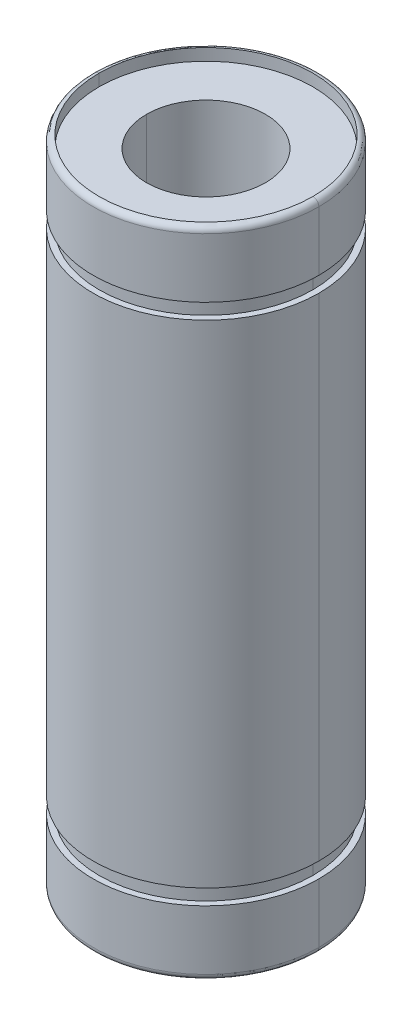
ISO-10303-21;
HEADER;
FILE_DESCRIPTION(('STEP AP214'),'2;1');
FILE_NAME('part.step','',(''),(''),'','','');
FILE_SCHEMA(('AUTOMOTIVE_DESIGN { 1 0 10303 214 1 1 1 1 }'));
ENDSEC;
DATA;
#1=APPLICATION_CONTEXT('core data for automotive mechanical design processes');
#2=APPLICATION_PROTOCOL_DEFINITION('international standard','automotive_design',2000,#1);
#3=PRODUCT_CONTEXT('',#1,'mechanical');
#4=PRODUCT('Part','Part','',(#3));
#5=PRODUCT_RELATED_PRODUCT_CATEGORY('part','',(#4));
#6=PRODUCT_DEFINITION_FORMATION('','',#4);
#7=PRODUCT_DEFINITION_CONTEXT('part definition',#1,'design');
#8=PRODUCT_DEFINITION('design','',#6,#7);
#9=PRODUCT_DEFINITION_SHAPE('','',#8);
#10=(LENGTH_UNIT() NAMED_UNIT(*) SI_UNIT(.MILLI.,.METRE.));
#11=(NAMED_UNIT(*) PLANE_ANGLE_UNIT() SI_UNIT($,.RADIAN.));
#12=(NAMED_UNIT(*) SI_UNIT($,.STERADIAN.) SOLID_ANGLE_UNIT());
#13=UNCERTAINTY_MEASURE_WITH_UNIT(LENGTH_MEASURE(1.E-05),#10,'distance_accuracy_value','');
#14=(GEOMETRIC_REPRESENTATION_CONTEXT(3) GLOBAL_UNCERTAINTY_ASSIGNED_CONTEXT((#13)) GLOBAL_UNIT_ASSIGNED_CONTEXT((#10,
#11,#12)) REPRESENTATION_CONTEXT('',''));
#15=CARTESIAN_POINT('',(0.,0.,0.));
#16=DIRECTION('',(0.,0.,1.));
#17=DIRECTION('',(1.,0.,0.));
#18=AXIS2_PLACEMENT_3D('',#15,#16,#17);
#19=CARTESIAN_POINT('',(138.847826098004,137.740489125517,27.5));
#20=DIRECTION('',(0.,-1.,0.));
#21=DIRECTION('',(-1.,0.,0.));
#22=AXIS2_PLACEMENT_3D('',#19,#20,#21);
#23=PLANE('',#22);
#24=CARTESIAN_POINT('',(138.847826098004,137.740489125517,27.5));
#25=DIRECTION('',(0.,1.,0.));
#26=DIRECTION('',(1.,0.,0.));
#27=AXIS2_PLACEMENT_3D('',#24,#25,#26);
#28=CIRCLE('',#27,9.);
#29=CARTESIAN_POINT('',(147.847826098004,137.740489125517,27.5));
#30=VERTEX_POINT('',#29);
#31=CARTESIAN_POINT('',(129.847826098004,137.740489125517,27.5));
#32=VERTEX_POINT('',#31);
#33=EDGE_CURVE('P0_E11',#30,#32,#28,.T.);
#34=ORIENTED_EDGE('',*,*,#33,.T.);
#35=CARTESIAN_POINT('',(138.847826098004,137.740489125517,27.5));
#36=DIRECTION('',(0.,1.,0.));
#37=DIRECTION('',(1.,0.,0.));
#38=AXIS2_PLACEMENT_3D('',#35,#36,#37);
#39=CIRCLE('',#38,9.);
#40=EDGE_CURVE('P0_E99',#32,#30,#39,.T.);
#41=ORIENTED_EDGE('',*,*,#40,.T.);
#42=EDGE_LOOP('',(#34,#41));
#43=FACE_BOUND('',#42,.T.);
#44=CARTESIAN_POINT('',(138.847826098004,137.740489125517,27.5));
#45=DIRECTION('',(0.,1.,0.));
#46=DIRECTION('',(1.,0.,0.));
#47=AXIS2_PLACEMENT_3D('',#44,#45,#46);
#48=CIRCLE('',#47,9.5);
#49=CARTESIAN_POINT('',(148.347826098004,137.740489125517,27.5));
#50=VERTEX_POINT('',#49);
#51=CARTESIAN_POINT('',(129.347826098004,137.740489125517,27.5));
#52=VERTEX_POINT('',#51);
#53=EDGE_CURVE('P0_E27',#50,#52,#48,.T.);
#54=ORIENTED_EDGE('',*,*,#53,.F.);
#55=CARTESIAN_POINT('',(138.847826098004,137.740489125517,27.5));
#56=DIRECTION('',(0.,1.,0.));
#57=DIRECTION('',(1.,0.,0.));
#58=AXIS2_PLACEMENT_3D('',#55,#56,#57);
#59=CIRCLE('',#58,9.5);
#60=EDGE_CURVE('P0_E86',#52,#50,#59,.T.);
#61=ORIENTED_EDGE('',*,*,#60,.F.);
#62=EDGE_LOOP('',(#54,#61));
#63=FACE_BOUND('',#62,.T.);
#64=ADVANCED_FACE('P0_F16',(#43,#63),#23,.T.);
#65=CARTESIAN_POINT('',(138.847826098004,143.240489125517,27.5));
#66=DIRECTION('',(0.,-1.,0.));
#67=DIRECTION('',(1.,0.,0.));
#68=AXIS2_PLACEMENT_3D('',#65,#66,#67);
#69=CYLINDRICAL_SURFACE('',#68,9.);
#70=DIRECTION('',(0.,1.,0.));
#71=VECTOR('',#70,1.);
#72=CARTESIAN_POINT('',(147.847826098004,143.240489125517,27.5));
#73=LINE('',#72,#71);
#74=CARTESIAN_POINT('',(147.847826098004,143.240489125517,27.5));
#75=VERTEX_POINT('',#74);
#76=EDGE_CURVE('P0_E92',#30,#75,#73,.T.);
#77=ORIENTED_EDGE('',*,*,#76,.T.);
#78=CARTESIAN_POINT('',(138.847826098004,143.240489125517,27.5));
#79=DIRECTION('',(0.,-1.,0.));
#80=DIRECTION('',(1.,0.,0.));
#81=AXIS2_PLACEMENT_3D('',#78,#79,#80);
#82=CIRCLE('',#81,9.);
#83=CARTESIAN_POINT('',(129.847826098004,143.240489125517,27.5));
#84=VERTEX_POINT('',#83);
#85=EDGE_CURVE('P0_E64',#84,#75,#82,.T.);
#86=ORIENTED_EDGE('',*,*,#85,.F.);
#87=DIRECTION('',(0.,-1.,0.));
#88=VECTOR('',#87,1.);
#89=CARTESIAN_POINT('',(129.847826098004,143.240489125517,27.5));
#90=LINE('',#89,#88);
#91=EDGE_CURVE('P0_E93',#84,#32,#90,.T.);
#92=ORIENTED_EDGE('',*,*,#91,.T.);
#93=ORIENTED_EDGE('',*,*,#33,.F.);
#94=EDGE_LOOP('',(#77,#86,#92,#93));
#95=FACE_BOUND('',#94,.T.);
#96=ADVANCED_FACE('P0_F18',(#95),#69,.F.);
#97=CARTESIAN_POINT('',(138.847826098004,143.240489125517,27.5));
#98=DIRECTION('',(0.,-1.,0.));
#99=DIRECTION('',(1.,0.,0.));
#100=AXIS2_PLACEMENT_3D('',#97,#98,#99);
#101=CYLINDRICAL_SURFACE('',#100,9.5);
#102=DIRECTION('',(0.,-1.,0.));
#103=VECTOR('',#102,1.);
#104=CARTESIAN_POINT('',(148.347826098004,140.240489125517,27.5));
#105=LINE('',#104,#103);
#106=CARTESIAN_POINT('',(148.347826098004,142.740489125517,27.5));
#107=VERTEX_POINT('',#106);
#108=EDGE_CURVE('P0_E95',#107,#50,#105,.T.);
#109=ORIENTED_EDGE('',*,*,#108,.T.);
#110=ORIENTED_EDGE('',*,*,#53,.T.);
#111=DIRECTION('',(0.,1.,0.));
#112=VECTOR('',#111,1.);
#113=CARTESIAN_POINT('',(129.347826098004,140.240489125517,27.5));
#114=LINE('',#113,#112);
#115=CARTESIAN_POINT('',(129.347826098004,142.740489125517,27.5));
#116=VERTEX_POINT('',#115);
#117=EDGE_CURVE('P0_E111',#52,#116,#114,.T.);
#118=ORIENTED_EDGE('',*,*,#117,.T.);
#119=CARTESIAN_POINT('',(138.847826098004,142.740489125517,27.5));
#120=DIRECTION('',(0.,1.,0.));
#121=DIRECTION('',(-1.,0.,0.));
#122=AXIS2_PLACEMENT_3D('',#119,#120,#121);
#123=CIRCLE('',#122,9.5);
#124=EDGE_CURVE('P0_E20',#107,#116,#123,.T.);
#125=ORIENTED_EDGE('',*,*,#124,.F.);
#126=EDGE_LOOP('',(#109,#110,#118,#125));
#127=FACE_BOUND('',#126,.T.);
#128=ADVANCED_FACE('P0_F126',(#127),#101,.T.);
#129=CARTESIAN_POINT('',(138.847826098004,142.740489125517,27.5));
#130=DIRECTION('',(0.,-1.,0.));
#131=DIRECTION('',(1.,0.,0.));
#132=AXIS2_PLACEMENT_3D('',#129,#130,#131);
#133=TOROIDAL_SURFACE('',#132,9.,0.5);
#134=CARTESIAN_POINT('',(147.847826098004,142.740489125517,27.5));
#135=DIRECTION('',(0.,0.,-1.));
#136=DIRECTION('',(1.,0.,0.));
#137=AXIS2_PLACEMENT_3D('',#134,#135,#136);
#138=CIRCLE('',#137,0.5);
#139=EDGE_CURVE('P0_E67',#75,#107,#138,.T.);
#140=ORIENTED_EDGE('',*,*,#139,.T.);
#141=ORIENTED_EDGE('',*,*,#124,.T.);
#142=CARTESIAN_POINT('',(129.847826098004,142.740489125517,27.5));
#143=DIRECTION('',(0.,0.,-1.));
#144=DIRECTION('',(-1.,0.,0.));
#145=AXIS2_PLACEMENT_3D('',#142,#143,#144);
#146=CIRCLE('',#145,0.5);
#147=EDGE_CURVE('P0_E70',#116,#84,#146,.T.);
#148=ORIENTED_EDGE('',*,*,#147,.T.);
#149=ORIENTED_EDGE('',*,*,#85,.T.);
#150=EDGE_LOOP('',(#140,#141,#148,#149));
#151=FACE_BOUND('',#150,.T.);
#152=ADVANCED_FACE('P0_F66',(#151),#133,.T.);
#153=CARTESIAN_POINT('',(138.847826098004,142.740489125517,27.5));
#154=DIRECTION('',(0.,-1.,0.));
#155=DIRECTION('',(1.,0.,0.));
#156=AXIS2_PLACEMENT_3D('',#153,#154,#155);
#157=TOROIDAL_SURFACE('',#156,9.,0.5);
#158=ORIENTED_EDGE('',*,*,#139,.F.);
#159=CARTESIAN_POINT('',(138.847826098004,143.240489125517,27.5));
#160=DIRECTION('',(0.,-1.,0.));
#161=DIRECTION('',(1.,0.,0.));
#162=AXIS2_PLACEMENT_3D('',#159,#160,#161);
#163=CIRCLE('',#162,9.);
#164=EDGE_CURVE('P0_E80',#75,#84,#163,.T.);
#165=ORIENTED_EDGE('',*,*,#164,.T.);
#166=ORIENTED_EDGE('',*,*,#147,.F.);
#167=CARTESIAN_POINT('',(138.847826098004,142.740489125517,27.5));
#168=DIRECTION('',(0.,1.,0.));
#169=DIRECTION('',(-1.,0.,0.));
#170=AXIS2_PLACEMENT_3D('',#167,#168,#169);
#171=CIRCLE('',#170,9.5);
#172=EDGE_CURVE('P0_E83',#116,#107,#171,.T.);
#173=ORIENTED_EDGE('',*,*,#172,.T.);
#174=EDGE_LOOP('',(#158,#165,#166,#173));
#175=FACE_BOUND('',#174,.T.);
#176=ADVANCED_FACE('P0_F79',(#175),#157,.T.);
#177=CARTESIAN_POINT('',(138.847826098004,143.240489125517,27.5));
#178=DIRECTION('',(0.,-1.,0.));
#179=DIRECTION('',(1.,0.,0.));
#180=AXIS2_PLACEMENT_3D('',#177,#178,#179);
#181=CYLINDRICAL_SURFACE('',#180,9.5);
#182=ORIENTED_EDGE('',*,*,#108,.F.);
#183=ORIENTED_EDGE('',*,*,#172,.F.);
#184=ORIENTED_EDGE('',*,*,#117,.F.);
#185=ORIENTED_EDGE('',*,*,#60,.T.);
#186=EDGE_LOOP('',(#182,#183,#184,#185));
#187=FACE_BOUND('',#186,.T.);
#188=ADVANCED_FACE('P0_F130',(#187),#181,.T.);
#189=CARTESIAN_POINT('',(138.847826098004,143.240489125517,27.5));
#190=DIRECTION('',(0.,-1.,0.));
#191=DIRECTION('',(1.,0.,0.));
#192=AXIS2_PLACEMENT_3D('',#189,#190,#191);
#193=CYLINDRICAL_SURFACE('',#192,9.);
#194=ORIENTED_EDGE('',*,*,#76,.F.);
#195=ORIENTED_EDGE('',*,*,#40,.F.);
#196=ORIENTED_EDGE('',*,*,#91,.F.);
#197=ORIENTED_EDGE('',*,*,#164,.F.);
#198=EDGE_LOOP('',(#194,#195,#196,#197));
#199=FACE_BOUND('',#198,.T.);
#200=ADVANCED_FACE('P0_F90',(#199),#193,.F.);
#201=CLOSED_SHELL('',(#64,#96,#128,#152,#176,#188,#200));
#202=MANIFOLD_SOLID_BREP('P0_B1',#201);
#203=CARTESIAN_POINT('',(138.847826098004,143.240489125517,27.5));
#204=DIRECTION('',(0.,-1.,0.));
#205=DIRECTION('',(1.,0.,0.));
#206=AXIS2_PLACEMENT_3D('',#203,#204,#205);
#207=CYLINDRICAL_SURFACE('',#206,9.);
#208=DIRECTION('',(0.,1.,0.));
#209=VECTOR('',#208,1.);
#210=CARTESIAN_POINT('',(147.847826098004,115.740488410262,27.5));
#211=LINE('',#210,#209);
#212=CARTESIAN_POINT('',(147.847826098004,95.0404876473222,27.5));
#213=VERTEX_POINT('',#212);
#214=CARTESIAN_POINT('',(147.847826098004,136.440489173201,27.5));
#215=VERTEX_POINT('',#214);
#216=EDGE_CURVE('P1_E83',#213,#215,#211,.T.);
#217=ORIENTED_EDGE('',*,*,#216,.T.);
#218=CARTESIAN_POINT('',(138.847826098004,136.440489173201,27.5));
#219=DIRECTION('',(0.,1.,0.));
#220=DIRECTION('',(1.,0.,0.));
#221=AXIS2_PLACEMENT_3D('',#218,#219,#220);
#222=CIRCLE('',#221,9.);
#223=CARTESIAN_POINT('',(129.847826098004,136.440489173201,27.5));
#224=VERTEX_POINT('',#223);
#225=EDGE_CURVE('P1_E11',#215,#224,#222,.T.);
#226=ORIENTED_EDGE('',*,*,#225,.T.);
#227=DIRECTION('',(0.,-1.,0.));
#228=VECTOR('',#227,1.);
#229=CARTESIAN_POINT('',(129.847826098004,115.740488410262,27.5));
#230=LINE('',#229,#228);
#231=CARTESIAN_POINT('',(129.847826098004,95.0404876473222,27.5));
#232=VERTEX_POINT('',#231);
#233=EDGE_CURVE('P1_E80',#224,#232,#230,.T.);
#234=ORIENTED_EDGE('',*,*,#233,.T.);
#235=CARTESIAN_POINT('',(138.847826098004,95.0404876473222,27.5));
#236=DIRECTION('',(0.,1.,0.));
#237=DIRECTION('',(1.,0.,0.));
#238=AXIS2_PLACEMENT_3D('',#235,#236,#237);
#239=CIRCLE('',#238,9.);
#240=EDGE_CURVE('P1_E76',#213,#232,#239,.T.);
#241=ORIENTED_EDGE('',*,*,#240,.F.);
#242=EDGE_LOOP('',(#217,#226,#234,#241));
#243=FACE_BOUND('',#242,.T.);
#244=ADVANCED_FACE('P1_F17',(#243),#207,.F.);
#245=CARTESIAN_POINT('',(138.847826098004,136.440489173201,27.5));
#246=DIRECTION('',(0.,-1.,0.));
#247=DIRECTION('',(-1.,0.,0.));
#248=AXIS2_PLACEMENT_3D('',#245,#246,#247);
#249=PLANE('',#248);
#250=ORIENTED_EDGE('',*,*,#225,.F.);
#251=CARTESIAN_POINT('',(138.847826098004,136.440489173201,27.5));
#252=DIRECTION('',(0.,1.,0.));
#253=DIRECTION('',(1.,0.,0.));
#254=AXIS2_PLACEMENT_3D('',#251,#252,#253);
#255=CIRCLE('',#254,9.);
#256=EDGE_CURVE('P1_E84',#224,#215,#255,.T.);
#257=ORIENTED_EDGE('',*,*,#256,.F.);
#258=EDGE_LOOP('',(#250,#257));
#259=FACE_BOUND('',#258,.T.);
#260=CARTESIAN_POINT('',(138.847826098004,136.440489173201,27.5));
#261=DIRECTION('',(0.,-1.,0.));
#262=DIRECTION('',(1.,0.,0.));
#263=AXIS2_PLACEMENT_3D('',#260,#261,#262);
#264=CIRCLE('',#263,9.5);
#265=CARTESIAN_POINT('',(148.347826098004,136.440489173201,27.5));
#266=VERTEX_POINT('',#265);
#267=CARTESIAN_POINT('',(129.347826098004,136.440489173201,27.5));
#268=VERTEX_POINT('',#267);
#269=EDGE_CURVE('P1_E114',#266,#268,#264,.T.);
#270=ORIENTED_EDGE('',*,*,#269,.F.);
#271=CARTESIAN_POINT('',(138.847826098004,136.440489173201,27.5));
#272=DIRECTION('',(0.,-1.,0.));
#273=DIRECTION('',(1.,0.,0.));
#274=AXIS2_PLACEMENT_3D('',#271,#272,#273);
#275=CIRCLE('',#274,9.5);
#276=EDGE_CURVE('P1_E26',#268,#266,#275,.T.);
#277=ORIENTED_EDGE('',*,*,#276,.F.);
#278=EDGE_LOOP('',(#270,#277));
#279=FACE_BOUND('',#278,.T.);
#280=ADVANCED_FACE('P1_F85',(#259,#279),#249,.F.);
#281=CARTESIAN_POINT('',(138.847826098004,136.440489173201,27.5));
#282=DIRECTION('',(0.,-1.,0.));
#283=DIRECTION('',(1.,0.,0.));
#284=AXIS2_PLACEMENT_3D('',#281,#282,#283);
#285=CYLINDRICAL_SURFACE('',#284,9.5);
#286=DIRECTION('',(0.,-1.,0.));
#287=VECTOR('',#286,1.);
#288=CARTESIAN_POINT('',(148.347826098004,136.440489173201,27.5));
#289=LINE('',#288,#287);
#290=CARTESIAN_POINT('',(148.347826098004,95.0404876473222,27.5));
#291=VERTEX_POINT('',#290);
#292=EDGE_CURVE('P1_E88',#266,#291,#289,.T.);
#293=ORIENTED_EDGE('',*,*,#292,.T.);
#294=CARTESIAN_POINT('',(138.847826098004,95.0404876473222,27.5));
#295=DIRECTION('',(0.,1.,0.));
#296=DIRECTION('',(1.,0.,0.));
#297=AXIS2_PLACEMENT_3D('',#294,#295,#296);
#298=CIRCLE('',#297,9.5);
#299=CARTESIAN_POINT('',(129.347826098004,95.0404876473222,27.5));
#300=VERTEX_POINT('',#299);
#301=EDGE_CURVE('P1_E39',#291,#300,#298,.T.);
#302=ORIENTED_EDGE('',*,*,#301,.T.);
#303=DIRECTION('',(0.,1.,0.));
#304=VECTOR('',#303,1.);
#305=CARTESIAN_POINT('',(129.347826098004,136.440489173201,27.5));
#306=LINE('',#305,#304);
#307=EDGE_CURVE('P1_E20',#300,#268,#306,.T.);
#308=ORIENTED_EDGE('',*,*,#307,.T.);
#309=ORIENTED_EDGE('',*,*,#276,.T.);
#310=EDGE_LOOP('',(#293,#302,#308,#309));
#311=FACE_BOUND('',#310,.T.);
#312=ADVANCED_FACE('P1_F147',(#311),#285,.T.);
#313=CARTESIAN_POINT('',(138.847826098004,95.0404876473222,27.5));
#314=DIRECTION('',(0.,-1.,0.));
#315=DIRECTION('',(-1.,0.,0.));
#316=AXIS2_PLACEMENT_3D('',#313,#314,#315);
#317=PLANE('',#316);
#318=CARTESIAN_POINT('',(138.847826098004,95.0404876473222,27.5));
#319=DIRECTION('',(0.,1.,0.));
#320=DIRECTION('',(1.,0.,0.));
#321=AXIS2_PLACEMENT_3D('',#318,#319,#320);
#322=CIRCLE('',#321,9.);
#323=EDGE_CURVE('P1_E91',#232,#213,#322,.T.);
#324=ORIENTED_EDGE('',*,*,#323,.T.);
#325=ORIENTED_EDGE('',*,*,#240,.T.);
#326=EDGE_LOOP('',(#324,#325));
#327=FACE_BOUND('',#326,.T.);
#328=ORIENTED_EDGE('',*,*,#301,.F.);
#329=CARTESIAN_POINT('',(138.847826098004,95.0404876473222,27.5));
#330=DIRECTION('',(0.,1.,0.));
#331=DIRECTION('',(1.,0.,0.));
#332=AXIS2_PLACEMENT_3D('',#329,#330,#331);
#333=CIRCLE('',#332,9.5);
#334=EDGE_CURVE('P1_E101',#300,#291,#333,.T.);
#335=ORIENTED_EDGE('',*,*,#334,.F.);
#336=EDGE_LOOP('',(#328,#335));
#337=FACE_BOUND('',#336,.T.);
#338=ADVANCED_FACE('P1_F156',(#327,#337),#317,.T.);
#339=CARTESIAN_POINT('',(138.847826098004,136.440489173201,27.5));
#340=DIRECTION('',(0.,-1.,0.));
#341=DIRECTION('',(1.,0.,0.));
#342=AXIS2_PLACEMENT_3D('',#339,#340,#341);
#343=CYLINDRICAL_SURFACE('',#342,9.5);
#344=ORIENTED_EDGE('',*,*,#292,.F.);
#345=ORIENTED_EDGE('',*,*,#269,.T.);
#346=ORIENTED_EDGE('',*,*,#307,.F.);
#347=ORIENTED_EDGE('',*,*,#334,.T.);
#348=EDGE_LOOP('',(#344,#345,#346,#347));
#349=FACE_BOUND('',#348,.T.);
#350=ADVANCED_FACE('P1_F148',(#349),#343,.T.);
#351=CARTESIAN_POINT('',(138.847826098004,143.240489125517,27.5));
#352=DIRECTION('',(0.,-1.,0.));
#353=DIRECTION('',(1.,0.,0.));
#354=AXIS2_PLACEMENT_3D('',#351,#352,#353);
#355=CYLINDRICAL_SURFACE('',#354,9.);
#356=ORIENTED_EDGE('',*,*,#216,.F.);
#357=ORIENTED_EDGE('',*,*,#323,.F.);
#358=ORIENTED_EDGE('',*,*,#233,.F.);
#359=ORIENTED_EDGE('',*,*,#256,.T.);
#360=EDGE_LOOP('',(#356,#357,#358,#359));
#361=FACE_BOUND('',#360,.T.);
#362=ADVANCED_FACE('P1_F90',(#361),#355,.F.);
#363=CLOSED_SHELL('',(#244,#280,#312,#338,#350,#362));
#364=MANIFOLD_SOLID_BREP('P1_B1',#363);
#365=CARTESIAN_POINT('',(138.847826098004,93.7404896023546,27.5));
#366=DIRECTION('',(0.,-1.,0.));
#367=DIRECTION('',(-1.,0.,0.));
#368=AXIS2_PLACEMENT_3D('',#365,#366,#367);
#369=PLANE('',#368);
#370=CARTESIAN_POINT('',(138.847826098004,93.7404896023546,27.5));
#371=DIRECTION('',(0.,1.,0.));
#372=DIRECTION('',(1.,0.,0.));
#373=AXIS2_PLACEMENT_3D('',#370,#371,#372);
#374=CIRCLE('',#373,9.);
#375=CARTESIAN_POINT('',(147.847826098004,93.7404896023546,27.5));
#376=VERTEX_POINT('',#375);
#377=CARTESIAN_POINT('',(129.847826098004,93.7404896023546,27.5));
#378=VERTEX_POINT('',#377);
#379=EDGE_CURVE('P2_E11',#376,#378,#374,.T.);
#380=ORIENTED_EDGE('',*,*,#379,.F.);
#381=CARTESIAN_POINT('',(138.847826098004,93.7404896023546,27.5));
#382=DIRECTION('',(0.,1.,0.));
#383=DIRECTION('',(1.,0.,0.));
#384=AXIS2_PLACEMENT_3D('',#381,#382,#383);
#385=CIRCLE('',#384,9.);
#386=EDGE_CURVE('P2_E75',#378,#376,#385,.T.);
#387=ORIENTED_EDGE('',*,*,#386,.F.);
#388=EDGE_LOOP('',(#380,#387));
#389=FACE_BOUND('',#388,.T.);
#390=CARTESIAN_POINT('',(138.847826098004,93.7404896023546,27.5));
#391=DIRECTION('',(0.,-1.,0.));
#392=DIRECTION('',(1.,0.,0.));
#393=AXIS2_PLACEMENT_3D('',#390,#391,#392);
#394=CIRCLE('',#393,9.5);
#395=CARTESIAN_POINT('',(148.347826098004,93.7404896023546,27.5));
#396=VERTEX_POINT('',#395);
#397=CARTESIAN_POINT('',(129.347826098004,93.7404896023546,27.5));
#398=VERTEX_POINT('',#397);
#399=EDGE_CURVE('P2_E106',#396,#398,#394,.T.);
#400=ORIENTED_EDGE('',*,*,#399,.F.);
#401=CARTESIAN_POINT('',(138.847826098004,93.7404896023546,27.5));
#402=DIRECTION('',(0.,-1.,0.));
#403=DIRECTION('',(1.,0.,0.));
#404=AXIS2_PLACEMENT_3D('',#401,#402,#403);
#405=CIRCLE('',#404,9.5);
#406=EDGE_CURVE('P2_E27',#398,#396,#405,.T.);
#407=ORIENTED_EDGE('',*,*,#406,.F.);
#408=EDGE_LOOP('',(#400,#407));
#409=FACE_BOUND('',#408,.T.);
#410=ADVANCED_FACE('P2_F16',(#389,#409),#369,.F.);
#411=CARTESIAN_POINT('',(138.847826098004,143.240489125517,27.5));
#412=DIRECTION('',(0.,-1.,0.));
#413=DIRECTION('',(1.,0.,0.));
#414=AXIS2_PLACEMENT_3D('',#411,#412,#413);
#415=CYLINDRICAL_SURFACE('',#414,9.);
#416=DIRECTION('',(0.,1.,0.));
#417=VECTOR('',#416,1.);
#418=CARTESIAN_POINT('',(147.847826098004,90.990489363936,27.5));
#419=LINE('',#418,#417);
#420=CARTESIAN_POINT('',(147.847826098004,88.2404891255174,27.5));
#421=VERTEX_POINT('',#420);
#422=EDGE_CURVE('P2_E84',#421,#376,#419,.T.);
#423=ORIENTED_EDGE('',*,*,#422,.T.);
#424=ORIENTED_EDGE('',*,*,#379,.T.);
#425=DIRECTION('',(0.,-1.,0.));
#426=VECTOR('',#425,1.);
#427=CARTESIAN_POINT('',(129.847826098004,90.990489363936,27.5));
#428=LINE('',#427,#426);
#429=CARTESIAN_POINT('',(129.847826098004,88.2404896023546,27.5));
#430=VERTEX_POINT('',#429);
#431=EDGE_CURVE('P2_E85',#378,#430,#428,.T.);
#432=ORIENTED_EDGE('',*,*,#431,.T.);
#433=CARTESIAN_POINT('',(138.847826098004,88.2404896023546,27.5));
#434=DIRECTION('',(0.,1.,0.));
#435=DIRECTION('',(1.,0.,0.));
#436=AXIS2_PLACEMENT_3D('',#433,#434,#435);
#437=CIRCLE('',#436,9.);
#438=EDGE_CURVE('P2_E66',#421,#430,#437,.T.);
#439=ORIENTED_EDGE('',*,*,#438,.F.);
#440=EDGE_LOOP('',(#423,#424,#432,#439));
#441=FACE_BOUND('',#440,.T.);
#442=ADVANCED_FACE('P2_F18',(#441),#415,.F.);
#443=CARTESIAN_POINT('',(138.847826098004,93.7404896023546,27.5));
#444=DIRECTION('',(0.,-1.,0.));
#445=DIRECTION('',(1.,0.,0.));
#446=AXIS2_PLACEMENT_3D('',#443,#444,#445);
#447=CYLINDRICAL_SURFACE('',#446,9.5);
#448=DIRECTION('',(0.,-1.,0.));
#449=VECTOR('',#448,1.);
#450=CARTESIAN_POINT('',(148.347826098004,93.7404896023546,27.5));
#451=LINE('',#450,#449);
#452=CARTESIAN_POINT('',(148.347826098004,88.7404896023546,27.5));
#453=VERTEX_POINT('',#452);
#454=EDGE_CURVE('P2_E87',#396,#453,#451,.T.);
#455=ORIENTED_EDGE('',*,*,#454,.T.);
#456=CARTESIAN_POINT('',(138.847826098004,88.7404896023546,27.5));
#457=DIRECTION('',(0.,-1.,0.));
#458=DIRECTION('',(-1.,0.,0.));
#459=AXIS2_PLACEMENT_3D('',#456,#457,#458);
#460=CIRCLE('',#459,9.5);
#461=CARTESIAN_POINT('',(129.347826098004,88.7404896023546,27.5));
#462=VERTEX_POINT('',#461);
#463=EDGE_CURVE('P2_E40',#462,#453,#460,.T.);
#464=ORIENTED_EDGE('',*,*,#463,.F.);
#465=DIRECTION('',(0.,1.,0.));
#466=VECTOR('',#465,1.);
#467=CARTESIAN_POINT('',(129.347826098004,93.7404896023546,27.5));
#468=LINE('',#467,#466);
#469=EDGE_CURVE('P2_E109',#462,#398,#468,.T.);
#470=ORIENTED_EDGE('',*,*,#469,.T.);
#471=ORIENTED_EDGE('',*,*,#406,.T.);
#472=EDGE_LOOP('',(#455,#464,#470,#471));
#473=FACE_BOUND('',#472,.T.);
#474=ADVANCED_FACE('P2_F122',(#473),#447,.T.);
#475=CARTESIAN_POINT('',(138.847826098004,88.7404896023546,27.5));
#476=DIRECTION('',(0.,1.,0.));
#477=DIRECTION('',(-1.,0.,0.));
#478=AXIS2_PLACEMENT_3D('',#475,#476,#477);
#479=TOROIDAL_SURFACE('',#478,9.,0.5);
#480=CARTESIAN_POINT('',(129.847826098004,88.7404896023546,27.5));
#481=DIRECTION('',(0.,0.,-1.));
#482=DIRECTION('',(-1.,0.,0.));
#483=AXIS2_PLACEMENT_3D('',#480,#481,#482);
#484=CIRCLE('',#483,0.5);
#485=EDGE_CURVE('P2_E100',#430,#462,#484,.T.);
#486=ORIENTED_EDGE('',*,*,#485,.T.);
#487=ORIENTED_EDGE('',*,*,#463,.T.);
#488=CARTESIAN_POINT('',(147.847826098004,88.7404896023546,27.5));
#489=DIRECTION('',(0.,0.,-1.));
#490=DIRECTION('',(1.,0.,0.));
#491=AXIS2_PLACEMENT_3D('',#488,#489,#490);
#492=CIRCLE('',#491,0.5);
#493=EDGE_CURVE('P2_E20',#453,#421,#492,.T.);
#494=ORIENTED_EDGE('',*,*,#493,.T.);
#495=ORIENTED_EDGE('',*,*,#438,.T.);
#496=EDGE_LOOP('',(#486,#487,#494,#495));
#497=FACE_BOUND('',#496,.T.);
#498=ADVANCED_FACE('P2_F185',(#497),#479,.T.);
#499=CARTESIAN_POINT('',(138.847826098004,88.7404896023546,27.5));
#500=DIRECTION('',(0.,1.,0.));
#501=DIRECTION('',(-1.,0.,0.));
#502=AXIS2_PLACEMENT_3D('',#499,#500,#501);
#503=TOROIDAL_SURFACE('',#502,9.,0.5);
#504=ORIENTED_EDGE('',*,*,#485,.F.);
#505=CARTESIAN_POINT('',(138.847826098004,88.2404896023546,27.5));
#506=DIRECTION('',(0.,1.,0.));
#507=DIRECTION('',(1.,0.,0.));
#508=AXIS2_PLACEMENT_3D('',#505,#506,#507);
#509=CIRCLE('',#508,9.);
#510=EDGE_CURVE('P2_E89',#430,#421,#509,.T.);
#511=ORIENTED_EDGE('',*,*,#510,.T.);
#512=ORIENTED_EDGE('',*,*,#493,.F.);
#513=CARTESIAN_POINT('',(138.847826098004,88.7404896023546,27.5));
#514=DIRECTION('',(0.,-1.,0.));
#515=DIRECTION('',(-1.,0.,0.));
#516=AXIS2_PLACEMENT_3D('',#513,#514,#515);
#517=CIRCLE('',#516,9.5);
#518=EDGE_CURVE('P2_E103',#453,#462,#517,.T.);
#519=ORIENTED_EDGE('',*,*,#518,.T.);
#520=EDGE_LOOP('',(#504,#511,#512,#519));
#521=FACE_BOUND('',#520,.T.);
#522=ADVANCED_FACE('P2_F130',(#521),#503,.T.);
#523=CARTESIAN_POINT('',(138.847826098004,93.7404896023546,27.5));
#524=DIRECTION('',(0.,-1.,0.));
#525=DIRECTION('',(1.,0.,0.));
#526=AXIS2_PLACEMENT_3D('',#523,#524,#525);
#527=CYLINDRICAL_SURFACE('',#526,9.5);
#528=ORIENTED_EDGE('',*,*,#454,.F.);
#529=ORIENTED_EDGE('',*,*,#399,.T.);
#530=ORIENTED_EDGE('',*,*,#469,.F.);
#531=ORIENTED_EDGE('',*,*,#518,.F.);
#532=EDGE_LOOP('',(#528,#529,#530,#531));
#533=FACE_BOUND('',#532,.T.);
#534=ADVANCED_FACE('P2_F126',(#533),#527,.T.);
#535=CARTESIAN_POINT('',(138.847826098004,143.240489125517,27.5));
#536=DIRECTION('',(0.,-1.,0.));
#537=DIRECTION('',(1.,0.,0.));
#538=AXIS2_PLACEMENT_3D('',#535,#536,#537);
#539=CYLINDRICAL_SURFACE('',#538,9.);
#540=ORIENTED_EDGE('',*,*,#422,.F.);
#541=ORIENTED_EDGE('',*,*,#510,.F.);
#542=ORIENTED_EDGE('',*,*,#431,.F.);
#543=ORIENTED_EDGE('',*,*,#386,.T.);
#544=EDGE_LOOP('',(#540,#541,#542,#543));
#545=FACE_BOUND('',#544,.T.);
#546=ADVANCED_FACE('P2_F82',(#545),#539,.F.);
#547=CLOSED_SHELL('',(#410,#442,#474,#498,#522,#534,#546));
#548=MANIFOLD_SOLID_BREP('P2_B1',#547);
#549=CARTESIAN_POINT('',(138.847826098004,89.2404891255174,27.5));
#550=DIRECTION('',(0.,-1.,0.));
#551=DIRECTION('',(-1.,0.,0.));
#552=AXIS2_PLACEMENT_3D('',#549,#550,#551);
#553=PLANE('',#552);
#554=CARTESIAN_POINT('',(138.847826098004,89.2404891255174,27.5));
#555=DIRECTION('',(0.,1.,0.));
#556=DIRECTION('',(1.,0.,0.));
#557=AXIS2_PLACEMENT_3D('',#554,#555,#556);
#558=CIRCLE('',#557,5.);
#559=CARTESIAN_POINT('',(133.847826098004,89.2404891255174,27.5));
#560=VERTEX_POINT('',#559);
#561=CARTESIAN_POINT('',(143.847826098004,89.2404891255174,27.5));
#562=VERTEX_POINT('',#561);
#563=EDGE_CURVE('P3_E90',#560,#562,#558,.T.);
#564=ORIENTED_EDGE('',*,*,#563,.T.);
#565=CARTESIAN_POINT('',(138.847826098004,89.2404891255174,27.5));
#566=DIRECTION('',(0.,1.,0.));
#567=DIRECTION('',(1.,0.,0.));
#568=AXIS2_PLACEMENT_3D('',#565,#566,#567);
#569=CIRCLE('',#568,5.);
#570=EDGE_CURVE('P3_E105',#562,#560,#569,.T.);
#571=ORIENTED_EDGE('',*,*,#570,.T.);
#572=EDGE_LOOP('',(#564,#571));
#573=FACE_BOUND('',#572,.T.);
#574=CARTESIAN_POINT('',(138.847826098004,89.2404891255174,27.5));
#575=DIRECTION('',(0.,1.,0.));
#576=DIRECTION('',(1.,0.,0.));
#577=AXIS2_PLACEMENT_3D('',#574,#575,#576);
#578=CIRCLE('',#577,9.);
#579=CARTESIAN_POINT('',(147.847826098004,89.2404891255174,27.5));
#580=VERTEX_POINT('',#579);
#581=CARTESIAN_POINT('',(129.847826098004,89.2404891255174,27.5));
#582=VERTEX_POINT('',#581);
#583=EDGE_CURVE('P3_E19',#580,#582,#578,.T.);
#584=ORIENTED_EDGE('',*,*,#583,.F.);
#585=CARTESIAN_POINT('',(138.847826098004,89.2404891255174,27.5));
#586=DIRECTION('',(0.,1.,0.));
#587=DIRECTION('',(1.,0.,0.));
#588=AXIS2_PLACEMENT_3D('',#585,#586,#587);
#589=CIRCLE('',#588,9.);
#590=EDGE_CURVE('P3_E77',#582,#580,#589,.T.);
#591=ORIENTED_EDGE('',*,*,#590,.F.);
#592=EDGE_LOOP('',(#584,#591));
#593=FACE_BOUND('',#592,.T.);
#594=ADVANCED_FACE('P3_F16',(#573,#593),#553,.T.);
#595=CARTESIAN_POINT('',(138.847826098004,142.240489125517,27.5));
#596=DIRECTION('',(0.,-1.,0.));
#597=DIRECTION('',(-1.,0.,0.));
#598=AXIS2_PLACEMENT_3D('',#595,#596,#597);
#599=PLANE('',#598);
#600=CARTESIAN_POINT('',(138.847826098004,142.240489125517,27.5));
#601=DIRECTION('',(0.,-1.,0.));
#602=DIRECTION('',(1.,0.,0.));
#603=AXIS2_PLACEMENT_3D('',#600,#601,#602);
#604=CIRCLE('',#603,5.);
#605=CARTESIAN_POINT('',(133.847826098004,142.240489125517,27.5));
#606=VERTEX_POINT('',#605);
#607=CARTESIAN_POINT('',(143.847826098004,142.240489125517,27.5));
#608=VERTEX_POINT('',#607);
#609=EDGE_CURVE('P3_E38',#606,#608,#604,.T.);
#610=ORIENTED_EDGE('',*,*,#609,.T.);
#611=CARTESIAN_POINT('',(138.847826098004,142.240489125517,27.5));
#612=DIRECTION('',(0.,-1.,0.));
#613=DIRECTION('',(1.,0.,0.));
#614=AXIS2_PLACEMENT_3D('',#611,#612,#613);
#615=CIRCLE('',#614,5.);
#616=EDGE_CURVE('P3_E98',#608,#606,#615,.T.);
#617=ORIENTED_EDGE('',*,*,#616,.T.);
#618=EDGE_LOOP('',(#610,#617));
#619=FACE_BOUND('',#618,.T.);
#620=CARTESIAN_POINT('',(138.847826098004,142.240489125517,27.5));
#621=DIRECTION('',(0.,-1.,0.));
#622=DIRECTION('',(1.,0.,0.));
#623=AXIS2_PLACEMENT_3D('',#620,#621,#622);
#624=CIRCLE('',#623,9.);
#625=CARTESIAN_POINT('',(147.847826098004,142.240489125517,27.5));
#626=VERTEX_POINT('',#625);
#627=CARTESIAN_POINT('',(129.847826098004,142.240489125517,27.5));
#628=VERTEX_POINT('',#627);
#629=EDGE_CURVE('P3_E66',#626,#628,#624,.T.);
#630=ORIENTED_EDGE('',*,*,#629,.F.);
#631=CARTESIAN_POINT('',(138.847826098004,142.240489125517,27.5));
#632=DIRECTION('',(0.,-1.,0.));
#633=DIRECTION('',(1.,0.,0.));
#634=AXIS2_PLACEMENT_3D('',#631,#632,#633);
#635=CIRCLE('',#634,9.);
#636=EDGE_CURVE('P3_E11',#628,#626,#635,.T.);
#637=ORIENTED_EDGE('',*,*,#636,.F.);
#638=EDGE_LOOP('',(#630,#637));
#639=FACE_BOUND('',#638,.T.);
#640=ADVANCED_FACE('P3_F64',(#619,#639),#599,.F.);
#641=CARTESIAN_POINT('',(138.847826098004,142.240489125517,27.5));
#642=DIRECTION('',(0.,-1.,0.));
#643=DIRECTION('',(1.,0.,0.));
#644=AXIS2_PLACEMENT_3D('',#641,#642,#643);
#645=CYLINDRICAL_SURFACE('',#644,9.);
#646=DIRECTION('',(0.,-1.,0.));
#647=VECTOR('',#646,1.);
#648=CARTESIAN_POINT('',(147.847826098004,142.240489125517,27.5));
#649=LINE('',#648,#647);
#650=EDGE_CURVE('P3_E80',#626,#580,#649,.T.);
#651=ORIENTED_EDGE('',*,*,#650,.T.);
#652=ORIENTED_EDGE('',*,*,#583,.T.);
#653=DIRECTION('',(0.,1.,0.));
#654=VECTOR('',#653,1.);
#655=CARTESIAN_POINT('',(129.847826098004,142.240489125517,27.5));
#656=LINE('',#655,#654);
#657=EDGE_CURVE('P3_E71',#582,#628,#656,.T.);
#658=ORIENTED_EDGE('',*,*,#657,.T.);
#659=ORIENTED_EDGE('',*,*,#636,.T.);
#660=EDGE_LOOP('',(#651,#652,#658,#659));
#661=FACE_BOUND('',#660,.T.);
#662=ADVANCED_FACE('P3_F72',(#661),#645,.T.);
#663=CARTESIAN_POINT('',(138.847826098004,143.240489125517,27.5));
#664=DIRECTION('',(0.,-1.,0.));
#665=DIRECTION('',(1.,0.,0.));
#666=AXIS2_PLACEMENT_3D('',#663,#664,#665);
#667=CYLINDRICAL_SURFACE('',#666,5.);
#668=DIRECTION('',(0.,1.,0.));
#669=VECTOR('',#668,1.);
#670=CARTESIAN_POINT('',(143.847826098004,115.740489125517,27.5));
#671=LINE('',#670,#669);
#672=EDGE_CURVE('P3_E94',#562,#608,#671,.T.);
#673=ORIENTED_EDGE('',*,*,#672,.T.);
#674=ORIENTED_EDGE('',*,*,#609,.F.);
#675=DIRECTION('',(0.,-1.,0.));
#676=VECTOR('',#675,1.);
#677=CARTESIAN_POINT('',(133.847826098004,115.740489125517,27.5));
#678=LINE('',#677,#676);
#679=EDGE_CURVE('P3_E93',#606,#560,#678,.T.);
#680=ORIENTED_EDGE('',*,*,#679,.T.);
#681=ORIENTED_EDGE('',*,*,#570,.F.);
#682=EDGE_LOOP('',(#673,#674,#680,#681));
#683=FACE_BOUND('',#682,.T.);
#684=ADVANCED_FACE('P3_F104',(#683),#667,.F.);
#685=CARTESIAN_POINT('',(138.847826098004,143.240489125517,27.5));
#686=DIRECTION('',(0.,-1.,0.));
#687=DIRECTION('',(1.,0.,0.));
#688=AXIS2_PLACEMENT_3D('',#685,#686,#687);
#689=CYLINDRICAL_SURFACE('',#688,5.);
#690=ORIENTED_EDGE('',*,*,#672,.F.);
#691=ORIENTED_EDGE('',*,*,#563,.F.);
#692=ORIENTED_EDGE('',*,*,#679,.F.);
#693=ORIENTED_EDGE('',*,*,#616,.F.);
#694=EDGE_LOOP('',(#690,#691,#692,#693));
#695=FACE_BOUND('',#694,.T.);
#696=ADVANCED_FACE('P3_F109',(#695),#689,.F.);
#697=CARTESIAN_POINT('',(138.847826098004,142.240489125517,27.5));
#698=DIRECTION('',(0.,-1.,0.));
#699=DIRECTION('',(1.,0.,0.));
#700=AXIS2_PLACEMENT_3D('',#697,#698,#699);
#701=CYLINDRICAL_SURFACE('',#700,9.);
#702=ORIENTED_EDGE('',*,*,#650,.F.);
#703=ORIENTED_EDGE('',*,*,#629,.T.);
#704=ORIENTED_EDGE('',*,*,#657,.F.);
#705=ORIENTED_EDGE('',*,*,#590,.T.);
#706=EDGE_LOOP('',(#702,#703,#704,#705));
#707=FACE_BOUND('',#706,.T.);
#708=ADVANCED_FACE('P3_F79',(#707),#701,.T.);
#709=CLOSED_SHELL('',(#594,#640,#662,#684,#696,#708));
#710=MANIFOLD_SOLID_BREP('P3_B1',#709);
#711=ADVANCED_BREP_SHAPE_REPRESENTATION('',(#18,#202,#364,#548,#710),#14);
#712=SHAPE_DEFINITION_REPRESENTATION(#9,#711);
ENDSEC;
END-ISO-10303-21;
